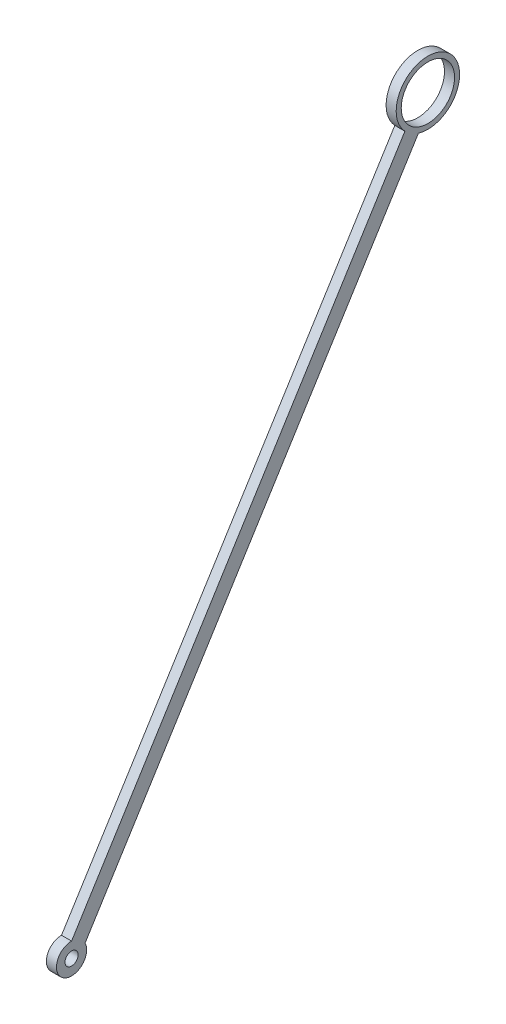
ISO-10303-21;
HEADER;
FILE_DESCRIPTION(('STEP AP214'),'2;1');
FILE_NAME('part.step','',(''),(''),'','','');
FILE_SCHEMA(('AUTOMOTIVE_DESIGN { 1 0 10303 214 1 1 1 1 }'));
ENDSEC;
DATA;
#1=APPLICATION_CONTEXT('core data for automotive mechanical design processes');
#2=APPLICATION_PROTOCOL_DEFINITION('international standard','automotive_design',2000,#1);
#3=PRODUCT_CONTEXT('',#1,'mechanical');
#4=PRODUCT('Part','Part','',(#3));
#5=PRODUCT_RELATED_PRODUCT_CATEGORY('part','',(#4));
#6=PRODUCT_DEFINITION_FORMATION('','',#4);
#7=PRODUCT_DEFINITION_CONTEXT('part definition',#1,'design');
#8=PRODUCT_DEFINITION('design','',#6,#7);
#9=PRODUCT_DEFINITION_SHAPE('','',#8);
#10=(LENGTH_UNIT() NAMED_UNIT(*) SI_UNIT(.MILLI.,.METRE.));
#11=(NAMED_UNIT(*) PLANE_ANGLE_UNIT() SI_UNIT($,.RADIAN.));
#12=(NAMED_UNIT(*) SI_UNIT($,.STERADIAN.) SOLID_ANGLE_UNIT());
#13=UNCERTAINTY_MEASURE_WITH_UNIT(LENGTH_MEASURE(1.E-05),#10,'distance_accuracy_value','');
#14=(GEOMETRIC_REPRESENTATION_CONTEXT(3) GLOBAL_UNCERTAINTY_ASSIGNED_CONTEXT((#13)) GLOBAL_UNIT_ASSIGNED_CONTEXT((#10,
#11,#12)) REPRESENTATION_CONTEXT('',''));
#15=CARTESIAN_POINT('',(0.,0.,0.));
#16=DIRECTION('',(0.,0.,1.));
#17=DIRECTION('',(1.,0.,0.));
#18=AXIS2_PLACEMENT_3D('',#15,#16,#17);
#19=CARTESIAN_POINT('',(15.0048094716167,59.9063850531949,43.4886195220377));
#20=DIRECTION('',(-1.,0.,0.));
#21=DIRECTION('',(0.,0.,1.));
#22=AXIS2_PLACEMENT_3D('',#19,#20,#21);
#23=PLANE('',#22);
#24=CARTESIAN_POINT('',(15.0048094716167,116.681273831879,8.09618467666838));
#25=DIRECTION('',(-1.,0.,0.));
#26=DIRECTION('',(0.,0.,1.));
#27=AXIS2_PLACEMENT_3D('',#24,#25,#26);
#28=CIRCLE('',#27,2.65);
#29=CARTESIAN_POINT('',(15.0048094716167,116.681273831879,10.7461846766684));
#30=VERTEX_POINT('',#29);
#31=EDGE_CURVE('E101',#30,#30,#28,.T.);
#32=ORIENTED_EDGE('',*,*,#31,.F.);
#33=EDGE_LOOP('',(#32));
#34=FACE_BOUND('',#33,.T.);
#35=CARTESIAN_POINT('',(15.0048094716167,59.9063850531949,43.4886195220377));
#36=DIRECTION('',(-1.,0.,0.));
#37=DIRECTION('',(0.,0.,1.));
#38=AXIS2_PLACEMENT_3D('',#35,#36,#37);
#39=CIRCLE('',#38,1.5);
#40=CARTESIAN_POINT('',(15.0048094716167,60.5668267670803,42.1418393831286));
#41=VERTEX_POINT('',#40);
#42=CARTESIAN_POINT('',(15.0048094716167,61.4063850531949,43.4886195220377));
#43=VERTEX_POINT('',#42);
#44=EDGE_CURVE('E86',#41,#43,#39,.T.);
#45=ORIENTED_EDGE('',*,*,#44,.T.);
#46=DIRECTION('',(0.,0.848614893789758,-0.529011117121558));
#47=VECTOR('',#46,1.);
#48=CARTESIAN_POINT('',(15.0048094716167,61.4063850531949,43.4886195220377));
#49=LINE('',#48,#47);
#50=CARTESIAN_POINT('',(15.0048094716167,114.514122983028,10.3822199341225));
#51=VERTEX_POINT('',#50);
#52=EDGE_CURVE('E81',#43,#51,#49,.T.);
#53=ORIENTED_EDGE('',*,*,#52,.T.);
#54=CARTESIAN_POINT('',(15.0048094716167,116.681273831879,8.09618467666838));
#55=DIRECTION('',(-1.,0.,0.));
#56=DIRECTION('',(0.,0.,1.));
#57=AXIS2_PLACEMENT_3D('',#54,#55,#56);
#58=CIRCLE('',#57,3.15);
#59=CARTESIAN_POINT('',(15.0048094716167,113.674564696913,9.03543979521336));
#60=VERTEX_POINT('',#59);
#61=EDGE_CURVE('E84',#51,#60,#58,.T.);
#62=ORIENTED_EDGE('',*,*,#61,.T.);
#63=DIRECTION('',(0.,-0.848614893789758,0.529011117121558));
#64=VECTOR('',#63,1.);
#65=CARTESIAN_POINT('',(15.0048094716167,60.5668267670803,42.1418393831286));
#66=LINE('',#65,#64);
#67=EDGE_CURVE('E51',#60,#41,#66,.T.);
#68=ORIENTED_EDGE('',*,*,#67,.T.);
#69=EDGE_LOOP('',(#45,#53,#62,#68));
#70=FACE_BOUND('',#69,.T.);
#71=CARTESIAN_POINT('',(15.0048094716167,59.9063850531949,43.4886195220377));
#72=DIRECTION('',(-1.,0.,0.));
#73=DIRECTION('',(0.,0.,1.));
#74=AXIS2_PLACEMENT_3D('',#71,#72,#73);
#75=CIRCLE('',#74,0.649999999999997);
#76=CARTESIAN_POINT('',(15.0048094716167,59.9063850531949,44.1386195220377));
#77=VERTEX_POINT('',#76);
#78=EDGE_CURVE('E116',#77,#77,#75,.T.);
#79=ORIENTED_EDGE('',*,*,#78,.F.);
#80=EDGE_LOOP('',(#79));
#81=FACE_BOUND('',#80,.T.);
#82=ADVANCED_FACE('F34',(#34,#70,#81),#23,.T.);
#83=CARTESIAN_POINT('',(16.0048094716167,59.9063850531949,43.4886195220377));
#84=DIRECTION('',(-1.,0.,0.));
#85=DIRECTION('',(0.,0.,1.));
#86=AXIS2_PLACEMENT_3D('',#83,#84,#85);
#87=PLANE('',#86);
#88=CARTESIAN_POINT('',(16.0048094716167,59.9063850531949,43.4886195220377));
#89=DIRECTION('',(-1.,0.,0.));
#90=DIRECTION('',(0.,0.,1.));
#91=AXIS2_PLACEMENT_3D('',#88,#89,#90);
#92=CIRCLE('',#91,1.5);
#93=CARTESIAN_POINT('',(16.0048094716167,60.5668267670803,42.1418393831286));
#94=VERTEX_POINT('',#93);
#95=CARTESIAN_POINT('',(16.0048094716167,61.4063850531949,43.4886195220377));
#96=VERTEX_POINT('',#95);
#97=EDGE_CURVE('E98',#94,#96,#92,.T.);
#98=ORIENTED_EDGE('',*,*,#97,.F.);
#99=DIRECTION('',(0.,-0.848614893789758,0.529011117121558));
#100=VECTOR('',#99,1.);
#101=CARTESIAN_POINT('',(16.0048094716167,60.5668267670803,42.1418393831286));
#102=LINE('',#101,#100);
#103=CARTESIAN_POINT('',(16.0048094716167,113.674564696913,9.03543979521336));
#104=VERTEX_POINT('',#103);
#105=EDGE_CURVE('E74',#104,#94,#102,.T.);
#106=ORIENTED_EDGE('',*,*,#105,.F.);
#107=CARTESIAN_POINT('',(16.0048094716167,116.681273831879,8.09618467666838));
#108=DIRECTION('',(-1.,0.,0.));
#109=DIRECTION('',(0.,0.,1.));
#110=AXIS2_PLACEMENT_3D('',#107,#108,#109);
#111=CIRCLE('',#110,3.15);
#112=CARTESIAN_POINT('',(16.0048094716167,114.514122983028,10.3822199341225));
#113=VERTEX_POINT('',#112);
#114=EDGE_CURVE('E68',#113,#104,#111,.T.);
#115=ORIENTED_EDGE('',*,*,#114,.F.);
#116=DIRECTION('',(0.,0.848614893789758,-0.529011117121558));
#117=VECTOR('',#116,1.);
#118=CARTESIAN_POINT('',(16.0048094716167,61.4063850531949,43.4886195220377));
#119=LINE('',#118,#117);
#120=EDGE_CURVE('E90',#96,#113,#119,.T.);
#121=ORIENTED_EDGE('',*,*,#120,.F.);
#122=EDGE_LOOP('',(#98,#106,#115,#121));
#123=FACE_BOUND('',#122,.T.);
#124=CARTESIAN_POINT('',(16.0048094716167,116.681273831879,8.09618467666838));
#125=DIRECTION('',(-1.,0.,0.));
#126=DIRECTION('',(0.,0.,1.));
#127=AXIS2_PLACEMENT_3D('',#124,#125,#126);
#128=CIRCLE('',#127,2.65);
#129=CARTESIAN_POINT('',(16.0048094716167,116.681273831879,10.7461846766684));
#130=VERTEX_POINT('',#129);
#131=EDGE_CURVE('E113',#130,#130,#128,.T.);
#132=ORIENTED_EDGE('',*,*,#131,.T.);
#133=EDGE_LOOP('',(#132));
#134=FACE_BOUND('',#133,.T.);
#135=CARTESIAN_POINT('',(16.0048094716167,59.9063850531949,43.4886195220377));
#136=DIRECTION('',(-1.,0.,0.));
#137=DIRECTION('',(0.,0.,1.));
#138=AXIS2_PLACEMENT_3D('',#135,#136,#137);
#139=CIRCLE('',#138,0.649999999999997);
#140=CARTESIAN_POINT('',(16.0048094716167,59.9063850531949,44.1386195220377));
#141=VERTEX_POINT('',#140);
#142=EDGE_CURVE('E119',#141,#141,#139,.T.);
#143=ORIENTED_EDGE('',*,*,#142,.T.);
#144=EDGE_LOOP('',(#143));
#145=FACE_BOUND('',#144,.T.);
#146=ADVANCED_FACE('F109',(#123,#134,#145),#87,.F.);
#147=CARTESIAN_POINT('',(15.0048094716167,59.9063850531949,43.4886195220377));
#148=DIRECTION('',(1.,0.,0.));
#149=DIRECTION('',(0.,0.,-1.));
#150=AXIS2_PLACEMENT_3D('',#147,#148,#149);
#151=CYLINDRICAL_SURFACE('',#150,1.5);
#152=ORIENTED_EDGE('',*,*,#97,.T.);
#153=DIRECTION('',(1.,0.,0.));
#154=VECTOR('',#153,1.);
#155=CARTESIAN_POINT('',(15.0048094716167,61.4063850531949,43.4886195220377));
#156=LINE('',#155,#154);
#157=EDGE_CURVE('E11',#43,#96,#156,.T.);
#158=ORIENTED_EDGE('',*,*,#157,.F.);
#159=ORIENTED_EDGE('',*,*,#44,.F.);
#160=DIRECTION('',(1.,0.,0.));
#161=VECTOR('',#160,1.);
#162=CARTESIAN_POINT('',(15.0048094716167,60.5668267670803,42.1418393831286));
#163=LINE('',#162,#161);
#164=EDGE_CURVE('E94',#41,#94,#163,.T.);
#165=ORIENTED_EDGE('',*,*,#164,.T.);
#166=EDGE_LOOP('',(#152,#158,#159,#165));
#167=FACE_BOUND('',#166,.T.);
#168=ADVANCED_FACE('F36',(#167),#151,.T.);
#169=CARTESIAN_POINT('',(15.0048094716167,61.4063850531949,43.4886195220377));
#170=DIRECTION('',(0.,-0.529011117121558,-0.848614893789758));
#171=DIRECTION('',(0.,0.848614893789758,-0.529011117121558));
#172=AXIS2_PLACEMENT_3D('',#169,#170,#171);
#173=PLANE('',#172);
#174=ORIENTED_EDGE('',*,*,#120,.T.);
#175=DIRECTION('',(1.,0.,0.));
#176=VECTOR('',#175,1.);
#177=CARTESIAN_POINT('',(15.0048094716167,114.514122983028,10.3822199341225));
#178=LINE('',#177,#176);
#179=EDGE_CURVE('E43',#51,#113,#178,.T.);
#180=ORIENTED_EDGE('',*,*,#179,.F.);
#181=ORIENTED_EDGE('',*,*,#52,.F.);
#182=ORIENTED_EDGE('',*,*,#157,.T.);
#183=EDGE_LOOP('',(#174,#180,#181,#182));
#184=FACE_BOUND('',#183,.T.);
#185=ADVANCED_FACE('F89',(#184),#173,.F.);
#186=CARTESIAN_POINT('',(15.0048094716167,116.681273831879,8.09618467666838));
#187=DIRECTION('',(1.,0.,0.));
#188=DIRECTION('',(0.,0.,-1.));
#189=AXIS2_PLACEMENT_3D('',#186,#187,#188);
#190=CYLINDRICAL_SURFACE('',#189,3.15);
#191=ORIENTED_EDGE('',*,*,#114,.T.);
#192=DIRECTION('',(1.,0.,0.));
#193=VECTOR('',#192,1.);
#194=CARTESIAN_POINT('',(15.0048094716167,113.674564696913,9.03543979521336));
#195=LINE('',#194,#193);
#196=EDGE_CURVE('E91',#60,#104,#195,.T.);
#197=ORIENTED_EDGE('',*,*,#196,.F.);
#198=ORIENTED_EDGE('',*,*,#61,.F.);
#199=ORIENTED_EDGE('',*,*,#179,.T.);
#200=EDGE_LOOP('',(#191,#197,#198,#199));
#201=FACE_BOUND('',#200,.T.);
#202=ADVANCED_FACE('F92',(#201),#190,.T.);
#203=CARTESIAN_POINT('',(15.0048094716167,60.5668267670803,42.1418393831286));
#204=DIRECTION('',(0.,0.529011117121558,0.848614893789758));
#205=DIRECTION('',(0.,-0.848614893789758,0.529011117121558));
#206=AXIS2_PLACEMENT_3D('',#203,#204,#205);
#207=PLANE('',#206);
#208=ORIENTED_EDGE('',*,*,#105,.T.);
#209=ORIENTED_EDGE('',*,*,#164,.F.);
#210=ORIENTED_EDGE('',*,*,#67,.F.);
#211=ORIENTED_EDGE('',*,*,#196,.T.);
#212=EDGE_LOOP('',(#208,#209,#210,#211));
#213=FACE_BOUND('',#212,.T.);
#214=ADVANCED_FACE('F106',(#213),#207,.F.);
#215=CARTESIAN_POINT('',(15.0048094716167,116.681273831879,8.09618467666838));
#216=DIRECTION('',(1.,0.,0.));
#217=DIRECTION('',(0.,0.,-1.));
#218=AXIS2_PLACEMENT_3D('',#215,#216,#217);
#219=CYLINDRICAL_SURFACE('',#218,2.65);
#220=ORIENTED_EDGE('',*,*,#31,.T.);
#221=EDGE_LOOP('',(#220));
#222=FACE_BOUND('',#221,.T.);
#223=ORIENTED_EDGE('',*,*,#131,.F.);
#224=EDGE_LOOP('',(#223));
#225=FACE_BOUND('',#224,.T.);
#226=ADVANCED_FACE('F136',(#222,#225),#219,.F.);
#227=CARTESIAN_POINT('',(15.0048094716167,59.9063850531949,43.4886195220377));
#228=DIRECTION('',(1.,0.,0.));
#229=DIRECTION('',(0.,0.,-1.));
#230=AXIS2_PLACEMENT_3D('',#227,#228,#229);
#231=CYLINDRICAL_SURFACE('',#230,0.649999999999997);
#232=ORIENTED_EDGE('',*,*,#78,.T.);
#233=EDGE_LOOP('',(#232));
#234=FACE_BOUND('',#233,.T.);
#235=ORIENTED_EDGE('',*,*,#142,.F.);
#236=EDGE_LOOP('',(#235));
#237=FACE_BOUND('',#236,.T.);
#238=ADVANCED_FACE('F125',(#234,#237),#231,.F.);
#239=CLOSED_SHELL('',(#82,#146,#168,#185,#202,#214,#226,#238));
#240=MANIFOLD_SOLID_BREP('B2',#239);
#241=ADVANCED_BREP_SHAPE_REPRESENTATION('',(#18,#240),#14);
#242=SHAPE_DEFINITION_REPRESENTATION(#9,#241);
ENDSEC;
END-ISO-10303-21;
